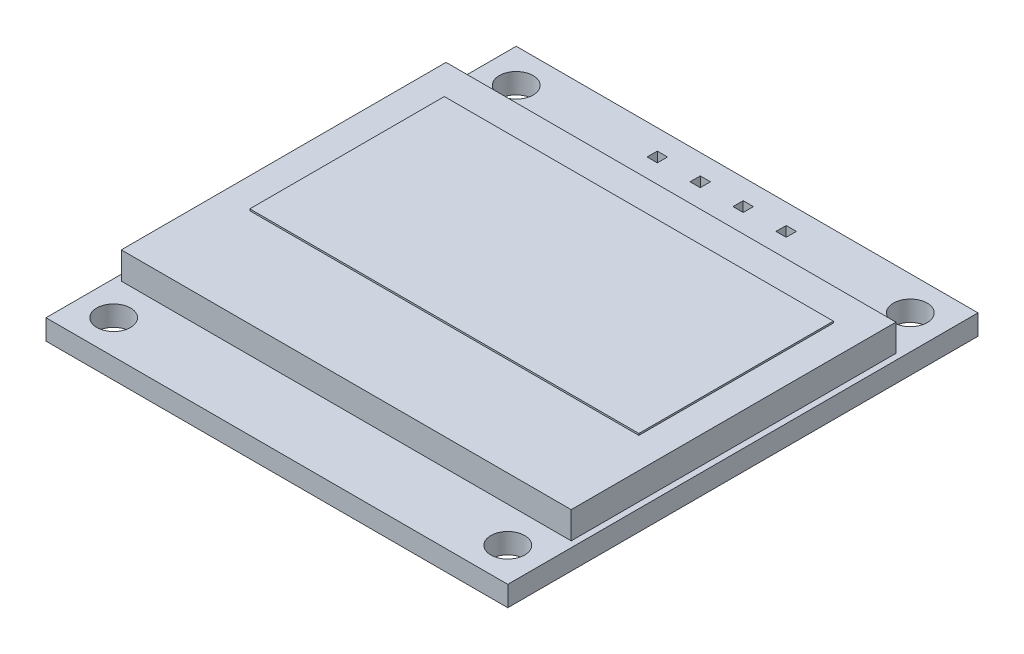
ISO-10303-21;
HEADER;
FILE_DESCRIPTION(('STEP AP214'),'2;1');
FILE_NAME('part.step','',(''),(''),'','','');
FILE_SCHEMA(('AUTOMOTIVE_DESIGN { 1 0 10303 214 1 1 1 1 }'));
ENDSEC;
DATA;
#1=APPLICATION_CONTEXT('core data for automotive mechanical design processes');
#2=APPLICATION_PROTOCOL_DEFINITION('international standard','automotive_design',2000,#1);
#3=PRODUCT_CONTEXT('',#1,'mechanical');
#4=PRODUCT('Part','Part','',(#3));
#5=PRODUCT_RELATED_PRODUCT_CATEGORY('part','',(#4));
#6=PRODUCT_DEFINITION_FORMATION('','',#4);
#7=PRODUCT_DEFINITION_CONTEXT('part definition',#1,'design');
#8=PRODUCT_DEFINITION('design','',#6,#7);
#9=PRODUCT_DEFINITION_SHAPE('','',#8);
#10=(LENGTH_UNIT() NAMED_UNIT(*) SI_UNIT(.MILLI.,.METRE.));
#11=(NAMED_UNIT(*) PLANE_ANGLE_UNIT() SI_UNIT($,.RADIAN.));
#12=(NAMED_UNIT(*) SI_UNIT($,.STERADIAN.) SOLID_ANGLE_UNIT());
#13=UNCERTAINTY_MEASURE_WITH_UNIT(LENGTH_MEASURE(1.E-05),#10,'distance_accuracy_value','');
#14=(GEOMETRIC_REPRESENTATION_CONTEXT(3) GLOBAL_UNCERTAINTY_ASSIGNED_CONTEXT((#13)) GLOBAL_UNIT_ASSIGNED_CONTEXT((#10,
#11,#12)) REPRESENTATION_CONTEXT('',''));
#15=CARTESIAN_POINT('',(0.,0.,0.));
#16=DIRECTION('',(0.,0.,1.));
#17=DIRECTION('',(1.,0.,0.));
#18=AXIS2_PLACEMENT_3D('',#15,#16,#17);
#19=CARTESIAN_POINT('',(0.,2.9,0.));
#20=DIRECTION('',(0.,-1.,0.));
#21=DIRECTION('',(0.,0.,-1.));
#22=AXIS2_PLACEMENT_3D('',#19,#20,#21);
#23=PLANE('',#22);
#24=DIRECTION('',(1.,0.,0.));
#25=VECTOR('',#24,1.);
#26=CARTESIAN_POINT('',(-11.5,2.9,-7.5));
#27=LINE('',#26,#25);
#28=CARTESIAN_POINT('',(11.5,2.9,-7.5));
#29=VERTEX_POINT('',#28);
#30=CARTESIAN_POINT('',(-11.5,2.9,-7.5));
#31=VERTEX_POINT('',#30);
#32=EDGE_CURVE('E207',#29,#31,#27,.F.);
#33=ORIENTED_EDGE('',*,*,#32,.T.);
#34=DIRECTION('',(0.,0.,-1.));
#35=VECTOR('',#34,1.);
#36=CARTESIAN_POINT('',(-11.5,2.9,4.));
#37=LINE('',#36,#35);
#38=CARTESIAN_POINT('',(-11.5,2.9,4.));
#39=VERTEX_POINT('',#38);
#40=EDGE_CURVE('E386',#31,#39,#37,.F.);
#41=ORIENTED_EDGE('',*,*,#40,.T.);
#42=DIRECTION('',(-1.,0.,0.));
#43=VECTOR('',#42,1.);
#44=CARTESIAN_POINT('',(-11.5,2.9,4.));
#45=LINE('',#44,#43);
#46=CARTESIAN_POINT('',(11.5,2.9,4.));
#47=VERTEX_POINT('',#46);
#48=EDGE_CURVE('E219',#39,#47,#45,.F.);
#49=ORIENTED_EDGE('',*,*,#48,.T.);
#50=DIRECTION('',(0.,0.,1.));
#51=VECTOR('',#50,1.);
#52=CARTESIAN_POINT('',(11.5,2.9,4.));
#53=LINE('',#52,#51);
#54=EDGE_CURVE('E201',#47,#29,#53,.F.);
#55=ORIENTED_EDGE('',*,*,#54,.T.);
#56=EDGE_LOOP('',(#33,#41,#49,#55));
#57=FACE_BOUND('',#56,.T.);
#58=ADVANCED_FACE('F17',(#57),#23,.F.);
#59=CARTESIAN_POINT('',(-11.5,2.9,-7.5));
#60=DIRECTION('',(0.,0.,1.));
#61=DIRECTION('',(1.,0.,0.));
#62=AXIS2_PLACEMENT_3D('',#59,#60,#61);
#63=PLANE('',#62);
#64=DIRECTION('',(0.,1.,0.));
#65=VECTOR('',#64,1.);
#66=CARTESIAN_POINT('',(-11.5,2.9,-7.5));
#67=LINE('',#66,#65);
#68=CARTESIAN_POINT('',(-11.5,2.8,-7.5));
#69=VERTEX_POINT('',#68);
#70=EDGE_CURVE('E212',#69,#31,#67,.T.);
#71=ORIENTED_EDGE('',*,*,#70,.T.);
#72=ORIENTED_EDGE('',*,*,#32,.F.);
#73=DIRECTION('',(0.,1.,0.));
#74=VECTOR('',#73,1.);
#75=CARTESIAN_POINT('',(11.5,2.9,-7.5));
#76=LINE('',#75,#74);
#77=CARTESIAN_POINT('',(11.5,2.8,-7.5));
#78=VERTEX_POINT('',#77);
#79=EDGE_CURVE('E210',#29,#78,#76,.F.);
#80=ORIENTED_EDGE('',*,*,#79,.T.);
#81=DIRECTION('',(1.,0.,0.));
#82=VECTOR('',#81,1.);
#83=CARTESIAN_POINT('',(0.,2.8,-7.5));
#84=LINE('',#83,#82);
#85=EDGE_CURVE('E381',#69,#78,#84,.T.);
#86=ORIENTED_EDGE('',*,*,#85,.F.);
#87=EDGE_LOOP('',(#71,#72,#80,#86));
#88=FACE_BOUND('',#87,.T.);
#89=ADVANCED_FACE('F208',(#88),#63,.F.);
#90=CARTESIAN_POINT('',(11.5,2.9,4.));
#91=DIRECTION('',(-1.,0.,0.));
#92=DIRECTION('',(0.,0.,1.));
#93=AXIS2_PLACEMENT_3D('',#90,#91,#92);
#94=PLANE('',#93);
#95=ORIENTED_EDGE('',*,*,#79,.F.);
#96=ORIENTED_EDGE('',*,*,#54,.F.);
#97=DIRECTION('',(0.,1.,0.));
#98=VECTOR('',#97,1.);
#99=CARTESIAN_POINT('',(11.5,2.9,4.));
#100=LINE('',#99,#98);
#101=CARTESIAN_POINT('',(11.5,2.8,4.));
#102=VERTEX_POINT('',#101);
#103=EDGE_CURVE('E389',#47,#102,#100,.F.);
#104=ORIENTED_EDGE('',*,*,#103,.T.);
#105=DIRECTION('',(0.,0.,1.));
#106=VECTOR('',#105,1.);
#107=CARTESIAN_POINT('',(11.5,2.8,0.));
#108=LINE('',#107,#106);
#109=EDGE_CURVE('E218',#78,#102,#108,.T.);
#110=ORIENTED_EDGE('',*,*,#109,.F.);
#111=EDGE_LOOP('',(#95,#96,#104,#110));
#112=FACE_BOUND('',#111,.T.);
#113=ADVANCED_FACE('F217',(#112),#94,.F.);
#114=CARTESIAN_POINT('',(-11.5,2.9,4.));
#115=DIRECTION('',(0.,0.,-1.));
#116=DIRECTION('',(-1.,0.,0.));
#117=AXIS2_PLACEMENT_3D('',#114,#115,#116);
#118=PLANE('',#117);
#119=ORIENTED_EDGE('',*,*,#103,.F.);
#120=ORIENTED_EDGE('',*,*,#48,.F.);
#121=DIRECTION('',(0.,1.,0.));
#122=VECTOR('',#121,1.);
#123=CARTESIAN_POINT('',(-11.5,2.9,4.));
#124=LINE('',#123,#122);
#125=CARTESIAN_POINT('',(-11.5,2.8,4.));
#126=VERTEX_POINT('',#125);
#127=EDGE_CURVE('E383',#39,#126,#124,.F.);
#128=ORIENTED_EDGE('',*,*,#127,.T.);
#129=DIRECTION('',(1.,0.,0.));
#130=VECTOR('',#129,1.);
#131=CARTESIAN_POINT('',(0.,2.8,4.));
#132=LINE('',#131,#130);
#133=EDGE_CURVE('E378',#102,#126,#132,.F.);
#134=ORIENTED_EDGE('',*,*,#133,.F.);
#135=EDGE_LOOP('',(#119,#120,#128,#134));
#136=FACE_BOUND('',#135,.T.);
#137=ADVANCED_FACE('F392',(#136),#118,.F.);
#138=CARTESIAN_POINT('',(-11.5,2.9,4.));
#139=DIRECTION('',(1.,0.,0.));
#140=DIRECTION('',(0.,0.,-1.));
#141=AXIS2_PLACEMENT_3D('',#138,#139,#140);
#142=PLANE('',#141);
#143=ORIENTED_EDGE('',*,*,#127,.F.);
#144=ORIENTED_EDGE('',*,*,#40,.F.);
#145=ORIENTED_EDGE('',*,*,#70,.F.);
#146=DIRECTION('',(0.,0.,1.));
#147=VECTOR('',#146,1.);
#148=CARTESIAN_POINT('',(-11.5,2.8,0.));
#149=LINE('',#148,#147);
#150=EDGE_CURVE('E375',#126,#69,#149,.F.);
#151=ORIENTED_EDGE('',*,*,#150,.F.);
#152=EDGE_LOOP('',(#143,#144,#145,#151));
#153=FACE_BOUND('',#152,.T.);
#154=ADVANCED_FACE('F399',(#153),#142,.F.);
#155=CARTESIAN_POINT('',(0.,2.8,0.));
#156=DIRECTION('',(0.,1.,0.));
#157=DIRECTION('',(0.,0.,1.));
#158=AXIS2_PLACEMENT_3D('',#155,#156,#157);
#159=PLANE('',#158);
#160=ORIENTED_EDGE('',*,*,#133,.T.);
#161=ORIENTED_EDGE('',*,*,#150,.T.);
#162=ORIENTED_EDGE('',*,*,#85,.T.);
#163=ORIENTED_EDGE('',*,*,#109,.T.);
#164=EDGE_LOOP('',(#160,#161,#162,#163));
#165=FACE_BOUND('',#164,.T.);
#166=DIRECTION('',(0.,0.,-1.));
#167=VECTOR('',#166,1.);
#168=CARTESIAN_POINT('',(-13.3,2.8,-9.4));
#169=LINE('',#168,#167);
#170=CARTESIAN_POINT('',(-13.3,2.8,-9.4));
#171=VERTEX_POINT('',#170);
#172=CARTESIAN_POINT('',(-13.3,2.8,9.8));
#173=VERTEX_POINT('',#172);
#174=EDGE_CURVE('E355',#171,#173,#169,.F.);
#175=ORIENTED_EDGE('',*,*,#174,.T.);
#176=DIRECTION('',(-1.,0.,0.));
#177=VECTOR('',#176,1.);
#178=CARTESIAN_POINT('',(-13.3,2.8,9.8));
#179=LINE('',#178,#177);
#180=CARTESIAN_POINT('',(13.3,2.8,9.8));
#181=VERTEX_POINT('',#180);
#182=EDGE_CURVE('E364',#173,#181,#179,.F.);
#183=ORIENTED_EDGE('',*,*,#182,.T.);
#184=DIRECTION('',(0.,0.,1.));
#185=VECTOR('',#184,1.);
#186=CARTESIAN_POINT('',(13.3,2.8,-9.4));
#187=LINE('',#186,#185);
#188=CARTESIAN_POINT('',(13.3,2.8,-9.4));
#189=VERTEX_POINT('',#188);
#190=EDGE_CURVE('E370',#181,#189,#187,.F.);
#191=ORIENTED_EDGE('',*,*,#190,.T.);
#192=DIRECTION('',(1.,0.,0.));
#193=VECTOR('',#192,1.);
#194=CARTESIAN_POINT('',(-13.3,2.8,-9.4));
#195=LINE('',#194,#193);
#196=EDGE_CURVE('E373',#189,#171,#195,.F.);
#197=ORIENTED_EDGE('',*,*,#196,.T.);
#198=EDGE_LOOP('',(#175,#183,#191,#197));
#199=FACE_BOUND('',#198,.T.);
#200=ADVANCED_FACE('F396',(#165,#199),#159,.T.);
#201=CARTESIAN_POINT('',(-13.3,2.8,-9.4));
#202=DIRECTION('',(0.,0.,1.));
#203=DIRECTION('',(1.,0.,0.));
#204=AXIS2_PLACEMENT_3D('',#201,#202,#203);
#205=PLANE('',#204);
#206=DIRECTION('',(0.,1.,0.));
#207=VECTOR('',#206,1.);
#208=CARTESIAN_POINT('',(-13.3,2.8,-9.4));
#209=LINE('',#208,#207);
#210=CARTESIAN_POINT('',(-13.3,1.2,-9.4));
#211=VERTEX_POINT('',#210);
#212=EDGE_CURVE('E358',#211,#171,#209,.T.);
#213=ORIENTED_EDGE('',*,*,#212,.T.);
#214=ORIENTED_EDGE('',*,*,#196,.F.);
#215=DIRECTION('',(0.,1.,0.));
#216=VECTOR('',#215,1.);
#217=CARTESIAN_POINT('',(13.3,2.8,-9.4));
#218=LINE('',#217,#216);
#219=CARTESIAN_POINT('',(13.3,1.2,-9.4));
#220=VERTEX_POINT('',#219);
#221=EDGE_CURVE('E367',#189,#220,#218,.F.);
#222=ORIENTED_EDGE('',*,*,#221,.T.);
#223=DIRECTION('',(1.,0.,0.));
#224=VECTOR('',#223,1.);
#225=CARTESIAN_POINT('',(0.,1.2,-9.4));
#226=LINE('',#225,#224);
#227=EDGE_CURVE('E350',#211,#220,#226,.T.);
#228=ORIENTED_EDGE('',*,*,#227,.F.);
#229=EDGE_LOOP('',(#213,#214,#222,#228));
#230=FACE_BOUND('',#229,.T.);
#231=ADVANCED_FACE('F407',(#230),#205,.F.);
#232=CARTESIAN_POINT('',(13.3,2.8,-9.4));
#233=DIRECTION('',(-1.,0.,0.));
#234=DIRECTION('',(0.,0.,1.));
#235=AXIS2_PLACEMENT_3D('',#232,#233,#234);
#236=PLANE('',#235);
#237=ORIENTED_EDGE('',*,*,#221,.F.);
#238=ORIENTED_EDGE('',*,*,#190,.F.);
#239=DIRECTION('',(0.,1.,0.));
#240=VECTOR('',#239,1.);
#241=CARTESIAN_POINT('',(13.3,2.8,9.8));
#242=LINE('',#241,#240);
#243=CARTESIAN_POINT('',(13.3,1.2,9.8));
#244=VERTEX_POINT('',#243);
#245=EDGE_CURVE('E361',#181,#244,#242,.F.);
#246=ORIENTED_EDGE('',*,*,#245,.T.);
#247=DIRECTION('',(0.,0.,1.));
#248=VECTOR('',#247,1.);
#249=CARTESIAN_POINT('',(13.3,1.2,0.));
#250=LINE('',#249,#248);
#251=EDGE_CURVE('E348',#220,#244,#250,.T.);
#252=ORIENTED_EDGE('',*,*,#251,.F.);
#253=EDGE_LOOP('',(#237,#238,#246,#252));
#254=FACE_BOUND('',#253,.T.);
#255=ADVANCED_FACE('F524',(#254),#236,.F.);
#256=CARTESIAN_POINT('',(-13.3,2.8,9.8));
#257=DIRECTION('',(0.,0.,-1.));
#258=DIRECTION('',(-1.,0.,0.));
#259=AXIS2_PLACEMENT_3D('',#256,#257,#258);
#260=PLANE('',#259);
#261=ORIENTED_EDGE('',*,*,#245,.F.);
#262=ORIENTED_EDGE('',*,*,#182,.F.);
#263=DIRECTION('',(0.,1.,0.));
#264=VECTOR('',#263,1.);
#265=CARTESIAN_POINT('',(-13.3,2.8,9.8));
#266=LINE('',#265,#264);
#267=CARTESIAN_POINT('',(-13.3,1.2,9.8));
#268=VERTEX_POINT('',#267);
#269=EDGE_CURVE('E352',#173,#268,#266,.F.);
#270=ORIENTED_EDGE('',*,*,#269,.T.);
#271=DIRECTION('',(1.,0.,0.));
#272=VECTOR('',#271,1.);
#273=CARTESIAN_POINT('',(0.,1.2,9.8));
#274=LINE('',#273,#272);
#275=EDGE_CURVE('E346',#244,#268,#274,.F.);
#276=ORIENTED_EDGE('',*,*,#275,.F.);
#277=EDGE_LOOP('',(#261,#262,#270,#276));
#278=FACE_BOUND('',#277,.T.);
#279=ADVANCED_FACE('F520',(#278),#260,.F.);
#280=CARTESIAN_POINT('',(-13.3,2.8,-9.4));
#281=DIRECTION('',(1.,0.,0.));
#282=DIRECTION('',(0.,0.,-1.));
#283=AXIS2_PLACEMENT_3D('',#280,#281,#282);
#284=PLANE('',#283);
#285=ORIENTED_EDGE('',*,*,#269,.F.);
#286=ORIENTED_EDGE('',*,*,#174,.F.);
#287=ORIENTED_EDGE('',*,*,#212,.F.);
#288=DIRECTION('',(0.,0.,1.));
#289=VECTOR('',#288,1.);
#290=CARTESIAN_POINT('',(-13.3,1.2,0.));
#291=LINE('',#290,#289);
#292=EDGE_CURVE('E343',#268,#211,#291,.F.);
#293=ORIENTED_EDGE('',*,*,#292,.F.);
#294=EDGE_LOOP('',(#285,#286,#287,#293));
#295=FACE_BOUND('',#294,.T.);
#296=ADVANCED_FACE('F516',(#295),#284,.F.);
#297=CARTESIAN_POINT('',(0.,1.2,0.));
#298=DIRECTION('',(0.,1.,0.));
#299=DIRECTION('',(0.,0.,1.));
#300=AXIS2_PLACEMENT_3D('',#297,#298,#299);
#301=PLANE('',#300);
#302=ORIENTED_EDGE('',*,*,#275,.T.);
#303=ORIENTED_EDGE('',*,*,#292,.T.);
#304=ORIENTED_EDGE('',*,*,#227,.T.);
#305=ORIENTED_EDGE('',*,*,#251,.T.);
#306=EDGE_LOOP('',(#302,#303,#304,#305));
#307=FACE_BOUND('',#306,.T.);
#308=CARTESIAN_POINT('',(11.65,1.2,11.9));
#309=DIRECTION('',(0.,-1.,0.));
#310=DIRECTION('',(0.,0.,-1.));
#311=AXIS2_PLACEMENT_3D('',#308,#309,#310);
#312=CIRCLE('',#311,1.);
#313=CARTESIAN_POINT('',(11.65,1.2,10.9));
#314=VERTEX_POINT('',#313);
#315=EDGE_CURVE('E20',#314,#314,#312,.T.);
#316=ORIENTED_EDGE('',*,*,#315,.T.);
#317=EDGE_LOOP('',(#316));
#318=FACE_BOUND('',#317,.T.);
#319=CARTESIAN_POINT('',(-11.65,1.2,-11.9));
#320=DIRECTION('',(0.,-1.,0.));
#321=DIRECTION('',(0.,0.,-1.));
#322=AXIS2_PLACEMENT_3D('',#319,#320,#321);
#323=CIRCLE('',#322,1.);
#324=CARTESIAN_POINT('',(-11.65,1.2,-12.9));
#325=VERTEX_POINT('',#324);
#326=EDGE_CURVE('E243',#325,#325,#323,.T.);
#327=ORIENTED_EDGE('',*,*,#326,.T.);
#328=EDGE_LOOP('',(#327));
#329=FACE_BOUND('',#328,.T.);
#330=DIRECTION('',(0.,0.,-1.));
#331=VECTOR('',#330,1.);
#332=CARTESIAN_POINT('',(-13.65,1.2,-13.9));
#333=LINE('',#332,#331);
#334=CARTESIAN_POINT('',(-13.65,1.2,-13.9));
#335=VERTEX_POINT('',#334);
#336=CARTESIAN_POINT('',(-13.65,1.2,13.9));
#337=VERTEX_POINT('',#336);
#338=EDGE_CURVE('E544',#335,#337,#333,.F.);
#339=ORIENTED_EDGE('',*,*,#338,.T.);
#340=DIRECTION('',(-1.,0.,0.));
#341=VECTOR('',#340,1.);
#342=CARTESIAN_POINT('',(-13.65,1.2,13.9));
#343=LINE('',#342,#341);
#344=CARTESIAN_POINT('',(13.65,1.2,13.9));
#345=VERTEX_POINT('',#344);
#346=EDGE_CURVE('E578',#337,#345,#343,.F.);
#347=ORIENTED_EDGE('',*,*,#346,.T.);
#348=DIRECTION('',(0.,0.,1.));
#349=VECTOR('',#348,1.);
#350=CARTESIAN_POINT('',(13.65,1.2,-13.9));
#351=LINE('',#350,#349);
#352=CARTESIAN_POINT('',(13.65,1.2,-13.9));
#353=VERTEX_POINT('',#352);
#354=EDGE_CURVE('E574',#345,#353,#351,.F.);
#355=ORIENTED_EDGE('',*,*,#354,.T.);
#356=DIRECTION('',(1.,0.,0.));
#357=VECTOR('',#356,1.);
#358=CARTESIAN_POINT('',(-13.65,1.2,-13.9));
#359=LINE('',#358,#357);
#360=EDGE_CURVE('E245',#353,#335,#359,.F.);
#361=ORIENTED_EDGE('',*,*,#360,.T.);
#362=EDGE_LOOP('',(#339,#347,#355,#361));
#363=FACE_BOUND('',#362,.T.);
#364=CARTESIAN_POINT('',(11.65,1.2,-11.9));
#365=DIRECTION('',(0.,-1.,0.));
#366=DIRECTION('',(0.,0.,-1.));
#367=AXIS2_PLACEMENT_3D('',#364,#365,#366);
#368=CIRCLE('',#367,1.);
#369=CARTESIAN_POINT('',(11.65,1.2,-12.9));
#370=VERTEX_POINT('',#369);
#371=EDGE_CURVE('E240',#370,#370,#368,.T.);
#372=ORIENTED_EDGE('',*,*,#371,.T.);
#373=EDGE_LOOP('',(#372));
#374=FACE_BOUND('',#373,.T.);
#375=CARTESIAN_POINT('',(-11.65,1.2,11.9));
#376=DIRECTION('',(0.,-1.,0.));
#377=DIRECTION('',(0.,0.,-1.));
#378=AXIS2_PLACEMENT_3D('',#375,#376,#377);
#379=CIRCLE('',#378,1.);
#380=CARTESIAN_POINT('',(-11.65,1.2,10.9));
#381=VERTEX_POINT('',#380);
#382=EDGE_CURVE('E236',#381,#381,#379,.T.);
#383=ORIENTED_EDGE('',*,*,#382,.T.);
#384=EDGE_LOOP('',(#383));
#385=FACE_BOUND('',#384,.T.);
#386=DIRECTION('',(0.,0.,1.));
#387=VECTOR('',#386,1.);
#388=CARTESIAN_POINT('',(-4.111420977446,1.2,-12.70142097744));
#389=LINE('',#388,#387);
#390=CARTESIAN_POINT('',(-4.111420977446,1.2,-12.09857902255));
#391=VERTEX_POINT('',#390);
#392=CARTESIAN_POINT('',(-4.111420977446,1.2,-12.70142097744));
#393=VERTEX_POINT('',#392);
#394=EDGE_CURVE('E278',#391,#393,#389,.F.);
#395=ORIENTED_EDGE('',*,*,#394,.T.);
#396=DIRECTION('',(-1.,0.,0.));
#397=VECTOR('',#396,1.);
#398=CARTESIAN_POINT('',(-4.111420977446,1.2,-12.70142097744));
#399=LINE('',#398,#397);
#400=CARTESIAN_POINT('',(-3.508579022554,1.2,-12.70142097744));
#401=VERTEX_POINT('',#400);
#402=EDGE_CURVE('E273',#393,#401,#399,.F.);
#403=ORIENTED_EDGE('',*,*,#402,.T.);
#404=DIRECTION('',(0.,0.,-1.));
#405=VECTOR('',#404,1.);
#406=CARTESIAN_POINT('',(-3.508579022554,1.2,-12.70142097744));
#407=LINE('',#406,#405);
#408=CARTESIAN_POINT('',(-3.508579022554,1.2,-12.09857902255));
#409=VERTEX_POINT('',#408);
#410=EDGE_CURVE('E268',#401,#409,#407,.F.);
#411=ORIENTED_EDGE('',*,*,#410,.T.);
#412=DIRECTION('',(1.,0.,0.));
#413=VECTOR('',#412,1.);
#414=CARTESIAN_POINT('',(-4.111420977446,1.2,-12.09857902255));
#415=LINE('',#414,#413);
#416=EDGE_CURVE('E255',#409,#391,#415,.F.);
#417=ORIENTED_EDGE('',*,*,#416,.T.);
#418=EDGE_LOOP('',(#395,#403,#411,#417));
#419=FACE_BOUND('',#418,.T.);
#420=DIRECTION('',(-1.,0.,0.));
#421=VECTOR('',#420,1.);
#422=CARTESIAN_POINT('',(-1.571420977446,1.2,-12.70142097744));
#423=LINE('',#422,#421);
#424=CARTESIAN_POINT('',(-1.571420977446,1.2,-12.70142097744));
#425=VERTEX_POINT('',#424);
#426=CARTESIAN_POINT('',(-0.968579022554,1.2,-12.70142097744));
#427=VERTEX_POINT('',#426);
#428=EDGE_CURVE('E299',#425,#427,#423,.F.);
#429=ORIENTED_EDGE('',*,*,#428,.T.);
#430=DIRECTION('',(0.,0.,-1.));
#431=VECTOR('',#430,1.);
#432=CARTESIAN_POINT('',(-0.968579022554,1.2,-12.70142097744));
#433=LINE('',#432,#431);
#434=CARTESIAN_POINT('',(-0.968579022554,1.2,-12.09857902255));
#435=VERTEX_POINT('',#434);
#436=EDGE_CURVE('E294',#427,#435,#433,.F.);
#437=ORIENTED_EDGE('',*,*,#436,.T.);
#438=DIRECTION('',(1.,0.,0.));
#439=VECTOR('',#438,1.);
#440=CARTESIAN_POINT('',(-1.571420977446,1.2,-12.09857902255));
#441=LINE('',#440,#439);
#442=CARTESIAN_POINT('',(-1.571420977446,1.2,-12.09857902255));
#443=VERTEX_POINT('',#442);
#444=EDGE_CURVE('E289',#435,#443,#441,.F.);
#445=ORIENTED_EDGE('',*,*,#444,.T.);
#446=DIRECTION('',(0.,0.,1.));
#447=VECTOR('',#446,1.);
#448=CARTESIAN_POINT('',(-1.571420977446,1.2,-12.70142097744));
#449=LINE('',#448,#447);
#450=EDGE_CURVE('E283',#443,#425,#449,.F.);
#451=ORIENTED_EDGE('',*,*,#450,.T.);
#452=EDGE_LOOP('',(#429,#437,#445,#451));
#453=FACE_BOUND('',#452,.T.);
#454=DIRECTION('',(-1.,0.,0.));
#455=VECTOR('',#454,1.);
#456=CARTESIAN_POINT('',(0.968579022554,1.2,-12.70142097744));
#457=LINE('',#456,#455);
#458=CARTESIAN_POINT('',(0.968579022554,1.2,-12.70142097744));
#459=VERTEX_POINT('',#458);
#460=CARTESIAN_POINT('',(1.571420977446,1.2,-12.70142097744));
#461=VERTEX_POINT('',#460);
#462=EDGE_CURVE('E320',#459,#461,#457,.F.);
#463=ORIENTED_EDGE('',*,*,#462,.T.);
#464=DIRECTION('',(0.,0.,-1.));
#465=VECTOR('',#464,1.);
#466=CARTESIAN_POINT('',(1.571420977446,1.2,-12.70142097744));
#467=LINE('',#466,#465);
#468=CARTESIAN_POINT('',(1.571420977446,1.2,-12.09857902255));
#469=VERTEX_POINT('',#468);
#470=EDGE_CURVE('E315',#461,#469,#467,.F.);
#471=ORIENTED_EDGE('',*,*,#470,.T.);
#472=DIRECTION('',(1.,0.,0.));
#473=VECTOR('',#472,1.);
#474=CARTESIAN_POINT('',(0.968579022554,1.2,-12.09857902255));
#475=LINE('',#474,#473);
#476=CARTESIAN_POINT('',(0.968579022554,1.2,-12.09857902255));
#477=VERTEX_POINT('',#476);
#478=EDGE_CURVE('E310',#469,#477,#475,.F.);
#479=ORIENTED_EDGE('',*,*,#478,.T.);
#480=DIRECTION('',(0.,0.,1.));
#481=VECTOR('',#480,1.);
#482=CARTESIAN_POINT('',(0.968579022554,1.2,-12.70142097744));
#483=LINE('',#482,#481);
#484=EDGE_CURVE('E304',#477,#459,#483,.F.);
#485=ORIENTED_EDGE('',*,*,#484,.T.);
#486=EDGE_LOOP('',(#463,#471,#479,#485));
#487=FACE_BOUND('',#486,.T.);
#488=DIRECTION('',(-1.,0.,0.));
#489=VECTOR('',#488,1.);
#490=CARTESIAN_POINT('',(3.508579022554,1.2,-12.70142097744));
#491=LINE('',#490,#489);
#492=CARTESIAN_POINT('',(3.508579022554,1.2,-12.70142097744));
#493=VERTEX_POINT('',#492);
#494=CARTESIAN_POINT('',(4.111420977446,1.2,-12.70142097744));
#495=VERTEX_POINT('',#494);
#496=EDGE_CURVE('E341',#493,#495,#491,.F.);
#497=ORIENTED_EDGE('',*,*,#496,.T.);
#498=DIRECTION('',(0.,0.,-1.));
#499=VECTOR('',#498,1.);
#500=CARTESIAN_POINT('',(4.111420977446,1.2,-12.70142097744));
#501=LINE('',#500,#499);
#502=CARTESIAN_POINT('',(4.111420977446,1.2,-12.09857902255));
#503=VERTEX_POINT('',#502);
#504=EDGE_CURVE('E336',#495,#503,#501,.F.);
#505=ORIENTED_EDGE('',*,*,#504,.T.);
#506=DIRECTION('',(1.,0.,0.));
#507=VECTOR('',#506,1.);
#508=CARTESIAN_POINT('',(3.508579022554,1.2,-12.09857902255));
#509=LINE('',#508,#507);
#510=CARTESIAN_POINT('',(3.508579022554,1.2,-12.09857902255));
#511=VERTEX_POINT('',#510);
#512=EDGE_CURVE('E331',#503,#511,#509,.F.);
#513=ORIENTED_EDGE('',*,*,#512,.T.);
#514=DIRECTION('',(0.,0.,1.));
#515=VECTOR('',#514,1.);
#516=CARTESIAN_POINT('',(3.508579022554,1.2,-12.70142097744));
#517=LINE('',#516,#515);
#518=EDGE_CURVE('E325',#511,#493,#517,.F.);
#519=ORIENTED_EDGE('',*,*,#518,.T.);
#520=EDGE_LOOP('',(#497,#505,#513,#519));
#521=FACE_BOUND('',#520,.T.);
#522=ADVANCED_FACE('F512',(#307,#318,#329,#363,#374,#385,#419,#453,#487,#521),#301,.T.);
#523=CARTESIAN_POINT('',(3.508579022554,-0.8,-12.70142097744));
#524=DIRECTION('',(0.,0.,-1.));
#525=DIRECTION('',(-1.,0.,0.));
#526=AXIS2_PLACEMENT_3D('',#523,#524,#525);
#527=PLANE('',#526);
#528=ORIENTED_EDGE('',*,*,#496,.F.);
#529=DIRECTION('',(0.,1.,0.));
#530=VECTOR('',#529,1.);
#531=CARTESIAN_POINT('',(3.508579022554,-0.8,-12.70142097744));
#532=LINE('',#531,#530);
#533=CARTESIAN_POINT('',(3.508579022554,0.,-12.70142097744));
#534=VERTEX_POINT('',#533);
#535=EDGE_CURVE('E322',#493,#534,#532,.F.);
#536=ORIENTED_EDGE('',*,*,#535,.T.);
#537=DIRECTION('',(1.,0.,0.));
#538=VECTOR('',#537,1.);
#539=CARTESIAN_POINT('',(0.,0.,-12.70142097744));
#540=LINE('',#539,#538);
#541=CARTESIAN_POINT('',(4.111420977446,0.,-12.70142097744));
#542=VERTEX_POINT('',#541);
#543=EDGE_CURVE('E239',#534,#542,#540,.T.);
#544=ORIENTED_EDGE('',*,*,#543,.T.);
#545=DIRECTION('',(0.,1.,0.));
#546=VECTOR('',#545,1.);
#547=CARTESIAN_POINT('',(4.111420977446,-0.8,-12.70142097744));
#548=LINE('',#547,#546);
#549=EDGE_CURVE('E338',#542,#495,#548,.T.);
#550=ORIENTED_EDGE('',*,*,#549,.T.);
#551=EDGE_LOOP('',(#528,#536,#544,#550));
#552=FACE_BOUND('',#551,.T.);
#553=ADVANCED_FACE('F508',(#552),#527,.F.);
#554=CARTESIAN_POINT('',(4.111420977446,-0.8,-12.70142097744));
#555=DIRECTION('',(1.,0.,0.));
#556=DIRECTION('',(0.,0.,-1.));
#557=AXIS2_PLACEMENT_3D('',#554,#555,#556);
#558=PLANE('',#557);
#559=ORIENTED_EDGE('',*,*,#504,.F.);
#560=ORIENTED_EDGE('',*,*,#549,.F.);
#561=DIRECTION('',(0.,0.,1.));
#562=VECTOR('',#561,1.);
#563=CARTESIAN_POINT('',(4.111420977446,0.,0.));
#564=LINE('',#563,#562);
#565=CARTESIAN_POINT('',(4.111420977446,0.,-12.09857902255));
#566=VERTEX_POINT('',#565);
#567=EDGE_CURVE('E566',#542,#566,#564,.T.);
#568=ORIENTED_EDGE('',*,*,#567,.T.);
#569=DIRECTION('',(0.,1.,0.));
#570=VECTOR('',#569,1.);
#571=CARTESIAN_POINT('',(4.111420977446,-0.8,-12.09857902255));
#572=LINE('',#571,#570);
#573=EDGE_CURVE('E333',#566,#503,#572,.T.);
#574=ORIENTED_EDGE('',*,*,#573,.T.);
#575=EDGE_LOOP('',(#559,#560,#568,#574));
#576=FACE_BOUND('',#575,.T.);
#577=ADVANCED_FACE('F504',(#576),#558,.F.);
#578=CARTESIAN_POINT('',(3.508579022554,-0.8,-12.09857902255));
#579=DIRECTION('',(0.,0.,1.));
#580=DIRECTION('',(1.,0.,0.));
#581=AXIS2_PLACEMENT_3D('',#578,#579,#580);
#582=PLANE('',#581);
#583=ORIENTED_EDGE('',*,*,#512,.F.);
#584=ORIENTED_EDGE('',*,*,#573,.F.);
#585=DIRECTION('',(1.,0.,0.));
#586=VECTOR('',#585,1.);
#587=CARTESIAN_POINT('',(0.,0.,-12.09857902255));
#588=LINE('',#587,#586);
#589=CARTESIAN_POINT('',(3.508579022554,0.,-12.09857902255));
#590=VERTEX_POINT('',#589);
#591=EDGE_CURVE('E568',#566,#590,#588,.F.);
#592=ORIENTED_EDGE('',*,*,#591,.T.);
#593=DIRECTION('',(0.,1.,0.));
#594=VECTOR('',#593,1.);
#595=CARTESIAN_POINT('',(3.508579022554,-0.8,-12.09857902255));
#596=LINE('',#595,#594);
#597=EDGE_CURVE('E328',#590,#511,#596,.T.);
#598=ORIENTED_EDGE('',*,*,#597,.T.);
#599=EDGE_LOOP('',(#583,#584,#592,#598));
#600=FACE_BOUND('',#599,.T.);
#601=ADVANCED_FACE('F500',(#600),#582,.F.);
#602=CARTESIAN_POINT('',(3.508579022554,-0.8,-12.70142097744));
#603=DIRECTION('',(-1.,0.,0.));
#604=DIRECTION('',(0.,0.,1.));
#605=AXIS2_PLACEMENT_3D('',#602,#603,#604);
#606=PLANE('',#605);
#607=ORIENTED_EDGE('',*,*,#518,.F.);
#608=ORIENTED_EDGE('',*,*,#597,.F.);
#609=DIRECTION('',(0.,0.,1.));
#610=VECTOR('',#609,1.);
#611=CARTESIAN_POINT('',(3.508579022554,0.,0.));
#612=LINE('',#611,#610);
#613=EDGE_CURVE('E632',#590,#534,#612,.F.);
#614=ORIENTED_EDGE('',*,*,#613,.T.);
#615=ORIENTED_EDGE('',*,*,#535,.F.);
#616=EDGE_LOOP('',(#607,#608,#614,#615));
#617=FACE_BOUND('',#616,.T.);
#618=ADVANCED_FACE('F496',(#617),#606,.F.);
#619=CARTESIAN_POINT('',(0.968579022554,-0.8,-12.70142097744));
#620=DIRECTION('',(0.,0.,-1.));
#621=DIRECTION('',(-1.,0.,0.));
#622=AXIS2_PLACEMENT_3D('',#619,#620,#621);
#623=PLANE('',#622);
#624=ORIENTED_EDGE('',*,*,#462,.F.);
#625=DIRECTION('',(0.,1.,0.));
#626=VECTOR('',#625,1.);
#627=CARTESIAN_POINT('',(0.968579022554,-0.8,-12.70142097744));
#628=LINE('',#627,#626);
#629=CARTESIAN_POINT('',(0.968579022554,0.,-12.70142097744));
#630=VERTEX_POINT('',#629);
#631=EDGE_CURVE('E301',#459,#630,#628,.F.);
#632=ORIENTED_EDGE('',*,*,#631,.T.);
#633=DIRECTION('',(1.,0.,0.));
#634=VECTOR('',#633,1.);
#635=CARTESIAN_POINT('',(0.,0.,-12.70142097744));
#636=LINE('',#635,#634);
#637=CARTESIAN_POINT('',(1.571420977446,0.,-12.70142097744));
#638=VERTEX_POINT('',#637);
#639=EDGE_CURVE('E629',#630,#638,#636,.T.);
#640=ORIENTED_EDGE('',*,*,#639,.T.);
#641=DIRECTION('',(0.,1.,0.));
#642=VECTOR('',#641,1.);
#643=CARTESIAN_POINT('',(1.571420977446,-0.8,-12.70142097744));
#644=LINE('',#643,#642);
#645=EDGE_CURVE('E317',#638,#461,#644,.T.);
#646=ORIENTED_EDGE('',*,*,#645,.T.);
#647=EDGE_LOOP('',(#624,#632,#640,#646));
#648=FACE_BOUND('',#647,.T.);
#649=ADVANCED_FACE('F492',(#648),#623,.F.);
#650=CARTESIAN_POINT('',(1.571420977446,-0.8,-12.70142097744));
#651=DIRECTION('',(1.,0.,0.));
#652=DIRECTION('',(0.,0.,-1.));
#653=AXIS2_PLACEMENT_3D('',#650,#651,#652);
#654=PLANE('',#653);
#655=ORIENTED_EDGE('',*,*,#470,.F.);
#656=ORIENTED_EDGE('',*,*,#645,.F.);
#657=DIRECTION('',(0.,0.,1.));
#658=VECTOR('',#657,1.);
#659=CARTESIAN_POINT('',(1.571420977446,0.,0.));
#660=LINE('',#659,#658);
#661=CARTESIAN_POINT('',(1.571420977446,0.,-12.09857902255));
#662=VERTEX_POINT('',#661);
#663=EDGE_CURVE('E626',#638,#662,#660,.T.);
#664=ORIENTED_EDGE('',*,*,#663,.T.);
#665=DIRECTION('',(0.,1.,0.));
#666=VECTOR('',#665,1.);
#667=CARTESIAN_POINT('',(1.571420977446,-0.8,-12.09857902255));
#668=LINE('',#667,#666);
#669=EDGE_CURVE('E312',#662,#469,#668,.T.);
#670=ORIENTED_EDGE('',*,*,#669,.T.);
#671=EDGE_LOOP('',(#655,#656,#664,#670));
#672=FACE_BOUND('',#671,.T.);
#673=ADVANCED_FACE('F488',(#672),#654,.F.);
#674=CARTESIAN_POINT('',(0.968579022554,-0.8,-12.09857902255));
#675=DIRECTION('',(0.,0.,1.));
#676=DIRECTION('',(1.,0.,0.));
#677=AXIS2_PLACEMENT_3D('',#674,#675,#676);
#678=PLANE('',#677);
#679=ORIENTED_EDGE('',*,*,#478,.F.);
#680=ORIENTED_EDGE('',*,*,#669,.F.);
#681=DIRECTION('',(1.,0.,0.));
#682=VECTOR('',#681,1.);
#683=CARTESIAN_POINT('',(0.,0.,-12.09857902255));
#684=LINE('',#683,#682);
#685=CARTESIAN_POINT('',(0.968579022554,0.,-12.09857902255));
#686=VERTEX_POINT('',#685);
#687=EDGE_CURVE('E623',#662,#686,#684,.F.);
#688=ORIENTED_EDGE('',*,*,#687,.T.);
#689=DIRECTION('',(0.,1.,0.));
#690=VECTOR('',#689,1.);
#691=CARTESIAN_POINT('',(0.968579022554,-0.8,-12.09857902255));
#692=LINE('',#691,#690);
#693=EDGE_CURVE('E307',#686,#477,#692,.T.);
#694=ORIENTED_EDGE('',*,*,#693,.T.);
#695=EDGE_LOOP('',(#679,#680,#688,#694));
#696=FACE_BOUND('',#695,.T.);
#697=ADVANCED_FACE('F484',(#696),#678,.F.);
#698=CARTESIAN_POINT('',(0.968579022554,-0.8,-12.70142097744));
#699=DIRECTION('',(-1.,0.,0.));
#700=DIRECTION('',(0.,0.,1.));
#701=AXIS2_PLACEMENT_3D('',#698,#699,#700);
#702=PLANE('',#701);
#703=ORIENTED_EDGE('',*,*,#484,.F.);
#704=ORIENTED_EDGE('',*,*,#693,.F.);
#705=DIRECTION('',(0.,0.,1.));
#706=VECTOR('',#705,1.);
#707=CARTESIAN_POINT('',(0.968579022554,0.,0.));
#708=LINE('',#707,#706);
#709=EDGE_CURVE('E620',#686,#630,#708,.F.);
#710=ORIENTED_EDGE('',*,*,#709,.T.);
#711=ORIENTED_EDGE('',*,*,#631,.F.);
#712=EDGE_LOOP('',(#703,#704,#710,#711));
#713=FACE_BOUND('',#712,.T.);
#714=ADVANCED_FACE('F480',(#713),#702,.F.);
#715=CARTESIAN_POINT('',(-1.571420977446,-0.8,-12.70142097744));
#716=DIRECTION('',(0.,0.,-1.));
#717=DIRECTION('',(-1.,0.,0.));
#718=AXIS2_PLACEMENT_3D('',#715,#716,#717);
#719=PLANE('',#718);
#720=ORIENTED_EDGE('',*,*,#428,.F.);
#721=DIRECTION('',(0.,1.,0.));
#722=VECTOR('',#721,1.);
#723=CARTESIAN_POINT('',(-1.571420977446,-0.8,-12.70142097744));
#724=LINE('',#723,#722);
#725=CARTESIAN_POINT('',(-1.571420977446,0.,-12.70142097744));
#726=VERTEX_POINT('',#725);
#727=EDGE_CURVE('E280',#425,#726,#724,.F.);
#728=ORIENTED_EDGE('',*,*,#727,.T.);
#729=DIRECTION('',(1.,0.,0.));
#730=VECTOR('',#729,1.);
#731=CARTESIAN_POINT('',(0.,0.,-12.70142097744));
#732=LINE('',#731,#730);
#733=CARTESIAN_POINT('',(-0.968579022554,0.,-12.70142097744));
#734=VERTEX_POINT('',#733);
#735=EDGE_CURVE('E617',#726,#734,#732,.T.);
#736=ORIENTED_EDGE('',*,*,#735,.T.);
#737=DIRECTION('',(0.,1.,0.));
#738=VECTOR('',#737,1.);
#739=CARTESIAN_POINT('',(-0.968579022554,-0.8,-12.70142097744));
#740=LINE('',#739,#738);
#741=EDGE_CURVE('E296',#734,#427,#740,.T.);
#742=ORIENTED_EDGE('',*,*,#741,.T.);
#743=EDGE_LOOP('',(#720,#728,#736,#742));
#744=FACE_BOUND('',#743,.T.);
#745=ADVANCED_FACE('F476',(#744),#719,.F.);
#746=CARTESIAN_POINT('',(-0.968579022554,-0.8,-12.70142097744));
#747=DIRECTION('',(1.,0.,0.));
#748=DIRECTION('',(0.,0.,-1.));
#749=AXIS2_PLACEMENT_3D('',#746,#747,#748);
#750=PLANE('',#749);
#751=ORIENTED_EDGE('',*,*,#436,.F.);
#752=ORIENTED_EDGE('',*,*,#741,.F.);
#753=DIRECTION('',(0.,0.,1.));
#754=VECTOR('',#753,1.);
#755=CARTESIAN_POINT('',(-0.968579022554,0.,0.));
#756=LINE('',#755,#754);
#757=CARTESIAN_POINT('',(-0.968579022554,0.,-12.09857902255));
#758=VERTEX_POINT('',#757);
#759=EDGE_CURVE('E614',#734,#758,#756,.T.);
#760=ORIENTED_EDGE('',*,*,#759,.T.);
#761=DIRECTION('',(0.,1.,0.));
#762=VECTOR('',#761,1.);
#763=CARTESIAN_POINT('',(-0.968579022554,-0.8,-12.09857902255));
#764=LINE('',#763,#762);
#765=EDGE_CURVE('E291',#758,#435,#764,.T.);
#766=ORIENTED_EDGE('',*,*,#765,.T.);
#767=EDGE_LOOP('',(#751,#752,#760,#766));
#768=FACE_BOUND('',#767,.T.);
#769=ADVANCED_FACE('F472',(#768),#750,.F.);
#770=CARTESIAN_POINT('',(-1.571420977446,-0.8,-12.09857902255));
#771=DIRECTION('',(0.,0.,1.));
#772=DIRECTION('',(1.,0.,0.));
#773=AXIS2_PLACEMENT_3D('',#770,#771,#772);
#774=PLANE('',#773);
#775=ORIENTED_EDGE('',*,*,#444,.F.);
#776=ORIENTED_EDGE('',*,*,#765,.F.);
#777=DIRECTION('',(1.,0.,0.));
#778=VECTOR('',#777,1.);
#779=CARTESIAN_POINT('',(0.,0.,-12.09857902255));
#780=LINE('',#779,#778);
#781=CARTESIAN_POINT('',(-1.571420977446,0.,-12.09857902255));
#782=VERTEX_POINT('',#781);
#783=EDGE_CURVE('E611',#758,#782,#780,.F.);
#784=ORIENTED_EDGE('',*,*,#783,.T.);
#785=DIRECTION('',(0.,1.,0.));
#786=VECTOR('',#785,1.);
#787=CARTESIAN_POINT('',(-1.571420977446,-0.8,-12.09857902255));
#788=LINE('',#787,#786);
#789=EDGE_CURVE('E286',#782,#443,#788,.T.);
#790=ORIENTED_EDGE('',*,*,#789,.T.);
#791=EDGE_LOOP('',(#775,#776,#784,#790));
#792=FACE_BOUND('',#791,.T.);
#793=ADVANCED_FACE('F468',(#792),#774,.F.);
#794=CARTESIAN_POINT('',(-1.571420977446,-0.8,-12.70142097744));
#795=DIRECTION('',(-1.,0.,0.));
#796=DIRECTION('',(0.,0.,1.));
#797=AXIS2_PLACEMENT_3D('',#794,#795,#796);
#798=PLANE('',#797);
#799=ORIENTED_EDGE('',*,*,#450,.F.);
#800=ORIENTED_EDGE('',*,*,#789,.F.);
#801=DIRECTION('',(0.,0.,1.));
#802=VECTOR('',#801,1.);
#803=CARTESIAN_POINT('',(-1.571420977446,0.,0.));
#804=LINE('',#803,#802);
#805=EDGE_CURVE('E608',#782,#726,#804,.F.);
#806=ORIENTED_EDGE('',*,*,#805,.T.);
#807=ORIENTED_EDGE('',*,*,#727,.F.);
#808=EDGE_LOOP('',(#799,#800,#806,#807));
#809=FACE_BOUND('',#808,.T.);
#810=ADVANCED_FACE('F465',(#809),#798,.F.);
#811=CARTESIAN_POINT('',(-4.111420977446,-0.8,-12.70142097744));
#812=DIRECTION('',(-1.,0.,0.));
#813=DIRECTION('',(0.,0.,1.));
#814=AXIS2_PLACEMENT_3D('',#811,#812,#813);
#815=PLANE('',#814);
#816=ORIENTED_EDGE('',*,*,#394,.F.);
#817=DIRECTION('',(0.,1.,0.));
#818=VECTOR('',#817,1.);
#819=CARTESIAN_POINT('',(-4.111420977446,-0.8,-12.09857902255));
#820=LINE('',#819,#818);
#821=CARTESIAN_POINT('',(-4.111420977446,0.,-12.09857902255));
#822=VERTEX_POINT('',#821);
#823=EDGE_CURVE('E251',#391,#822,#820,.F.);
#824=ORIENTED_EDGE('',*,*,#823,.T.);
#825=DIRECTION('',(0.,0.,1.));
#826=VECTOR('',#825,1.);
#827=CARTESIAN_POINT('',(-4.111420977446,0.,0.));
#828=LINE('',#827,#826);
#829=CARTESIAN_POINT('',(-4.111420977446,0.,-12.70142097744));
#830=VERTEX_POINT('',#829);
#831=EDGE_CURVE('E606',#822,#830,#828,.F.);
#832=ORIENTED_EDGE('',*,*,#831,.T.);
#833=DIRECTION('',(0.,1.,0.));
#834=VECTOR('',#833,1.);
#835=CARTESIAN_POINT('',(-4.111420977446,-0.8,-12.70142097744));
#836=LINE('',#835,#834);
#837=EDGE_CURVE('E275',#830,#393,#836,.T.);
#838=ORIENTED_EDGE('',*,*,#837,.T.);
#839=EDGE_LOOP('',(#816,#824,#832,#838));
#840=FACE_BOUND('',#839,.T.);
#841=ADVANCED_FACE('F461',(#840),#815,.F.);
#842=CARTESIAN_POINT('',(-4.111420977446,-0.8,-12.70142097744));
#843=DIRECTION('',(0.,0.,-1.));
#844=DIRECTION('',(-1.,0.,0.));
#845=AXIS2_PLACEMENT_3D('',#842,#843,#844);
#846=PLANE('',#845);
#847=ORIENTED_EDGE('',*,*,#402,.F.);
#848=ORIENTED_EDGE('',*,*,#837,.F.);
#849=DIRECTION('',(1.,0.,0.));
#850=VECTOR('',#849,1.);
#851=CARTESIAN_POINT('',(0.,0.,-12.70142097744));
#852=LINE('',#851,#850);
#853=CARTESIAN_POINT('',(-3.508579022554,0.,-12.70142097744));
#854=VERTEX_POINT('',#853);
#855=EDGE_CURVE('E603',#830,#854,#852,.T.);
#856=ORIENTED_EDGE('',*,*,#855,.T.);
#857=DIRECTION('',(0.,1.,0.));
#858=VECTOR('',#857,1.);
#859=CARTESIAN_POINT('',(-3.508579022554,-0.8,-12.70142097744));
#860=LINE('',#859,#858);
#861=EDGE_CURVE('E270',#854,#401,#860,.T.);
#862=ORIENTED_EDGE('',*,*,#861,.T.);
#863=EDGE_LOOP('',(#847,#848,#856,#862));
#864=FACE_BOUND('',#863,.T.);
#865=ADVANCED_FACE('F457',(#864),#846,.F.);
#866=CARTESIAN_POINT('',(-3.508579022554,-0.8,-12.70142097744));
#867=DIRECTION('',(1.,0.,0.));
#868=DIRECTION('',(0.,0.,-1.));
#869=AXIS2_PLACEMENT_3D('',#866,#867,#868);
#870=PLANE('',#869);
#871=ORIENTED_EDGE('',*,*,#410,.F.);
#872=ORIENTED_EDGE('',*,*,#861,.F.);
#873=DIRECTION('',(0.,0.,1.));
#874=VECTOR('',#873,1.);
#875=CARTESIAN_POINT('',(-3.508579022554,0.,0.));
#876=LINE('',#875,#874);
#877=CARTESIAN_POINT('',(-3.508579022554,0.,-12.09857902255));
#878=VERTEX_POINT('',#877);
#879=EDGE_CURVE('E600',#854,#878,#876,.T.);
#880=ORIENTED_EDGE('',*,*,#879,.T.);
#881=DIRECTION('',(0.,1.,0.));
#882=VECTOR('',#881,1.);
#883=CARTESIAN_POINT('',(-3.508579022554,-0.8,-12.09857902255));
#884=LINE('',#883,#882);
#885=EDGE_CURVE('E262',#878,#409,#884,.T.);
#886=ORIENTED_EDGE('',*,*,#885,.T.);
#887=EDGE_LOOP('',(#871,#872,#880,#886));
#888=FACE_BOUND('',#887,.T.);
#889=ADVANCED_FACE('F453',(#888),#870,.F.);
#890=CARTESIAN_POINT('',(-4.111420977446,-0.8,-12.09857902255));
#891=DIRECTION('',(0.,0.,1.));
#892=DIRECTION('',(1.,0.,0.));
#893=AXIS2_PLACEMENT_3D('',#890,#891,#892);
#894=PLANE('',#893);
#895=ORIENTED_EDGE('',*,*,#416,.F.);
#896=ORIENTED_EDGE('',*,*,#885,.F.);
#897=DIRECTION('',(1.,0.,0.));
#898=VECTOR('',#897,1.);
#899=CARTESIAN_POINT('',(0.,0.,-12.09857902255));
#900=LINE('',#899,#898);
#901=EDGE_CURVE('E235',#878,#822,#900,.F.);
#902=ORIENTED_EDGE('',*,*,#901,.T.);
#903=ORIENTED_EDGE('',*,*,#823,.F.);
#904=EDGE_LOOP('',(#895,#896,#902,#903));
#905=FACE_BOUND('',#904,.T.);
#906=ADVANCED_FACE('F449',(#905),#894,.F.);
#907=CARTESIAN_POINT('',(11.65,1.2,11.9));
#908=DIRECTION('',(0.,-1.,0.));
#909=DIRECTION('',(0.,0.,-1.));
#910=AXIS2_PLACEMENT_3D('',#907,#908,#909);
#911=CYLINDRICAL_SURFACE('',#910,1.);
#912=CARTESIAN_POINT('',(11.65,0.,11.9));
#913=DIRECTION('',(0.,-1.,0.));
#914=DIRECTION('',(0.,0.,-1.));
#915=AXIS2_PLACEMENT_3D('',#912,#913,#914);
#916=CIRCLE('',#915,1.);
#917=CARTESIAN_POINT('',(11.65,0.,10.9));
#918=VERTEX_POINT('',#917);
#919=EDGE_CURVE('E232',#918,#918,#916,.T.);
#920=ORIENTED_EDGE('',*,*,#919,.T.);
#921=EDGE_LOOP('',(#920));
#922=FACE_BOUND('',#921,.T.);
#923=ORIENTED_EDGE('',*,*,#315,.F.);
#924=EDGE_LOOP('',(#923));
#925=FACE_BOUND('',#924,.T.);
#926=ADVANCED_FACE('F445',(#922,#925),#911,.F.);
#927=CARTESIAN_POINT('',(-11.65,1.2,-11.9));
#928=DIRECTION('',(0.,-1.,0.));
#929=DIRECTION('',(0.,0.,-1.));
#930=AXIS2_PLACEMENT_3D('',#927,#928,#929);
#931=CYLINDRICAL_SURFACE('',#930,1.);
#932=CARTESIAN_POINT('',(-11.65,0.,-11.9));
#933=DIRECTION('',(0.,-1.,0.));
#934=DIRECTION('',(0.,0.,-1.));
#935=AXIS2_PLACEMENT_3D('',#932,#933,#934);
#936=CIRCLE('',#935,1.);
#937=CARTESIAN_POINT('',(-11.65,0.,-12.9));
#938=VERTEX_POINT('',#937);
#939=EDGE_CURVE('E228',#938,#938,#936,.T.);
#940=ORIENTED_EDGE('',*,*,#939,.T.);
#941=EDGE_LOOP('',(#940));
#942=FACE_BOUND('',#941,.T.);
#943=ORIENTED_EDGE('',*,*,#326,.F.);
#944=EDGE_LOOP('',(#943));
#945=FACE_BOUND('',#944,.T.);
#946=ADVANCED_FACE('F441',(#942,#945),#931,.F.);
#947=CARTESIAN_POINT('',(-13.65,1.2,-13.9));
#948=DIRECTION('',(0.,0.,1.));
#949=DIRECTION('',(1.,0.,0.));
#950=AXIS2_PLACEMENT_3D('',#947,#948,#949);
#951=PLANE('',#950);
#952=DIRECTION('',(0.,1.,0.));
#953=VECTOR('',#952,1.);
#954=CARTESIAN_POINT('',(-13.65,1.2,-13.9));
#955=LINE('',#954,#953);
#956=CARTESIAN_POINT('',(-13.65,0.,-13.9));
#957=VERTEX_POINT('',#956);
#958=EDGE_CURVE('E248',#957,#335,#955,.T.);
#959=ORIENTED_EDGE('',*,*,#958,.T.);
#960=ORIENTED_EDGE('',*,*,#360,.F.);
#961=DIRECTION('',(0.,1.,0.));
#962=VECTOR('',#961,1.);
#963=CARTESIAN_POINT('',(13.65,1.2,-13.9));
#964=LINE('',#963,#962);
#965=CARTESIAN_POINT('',(13.65,0.,-13.9));
#966=VERTEX_POINT('',#965);
#967=EDGE_CURVE('E242',#353,#966,#964,.F.);
#968=ORIENTED_EDGE('',*,*,#967,.T.);
#969=DIRECTION('',(1.,0.,0.));
#970=VECTOR('',#969,1.);
#971=CARTESIAN_POINT('',(0.,0.,-13.9));
#972=LINE('',#971,#970);
#973=EDGE_CURVE('E231',#966,#957,#972,.F.);
#974=ORIENTED_EDGE('',*,*,#973,.T.);
#975=EDGE_LOOP('',(#959,#960,#968,#974));
#976=FACE_BOUND('',#975,.T.);
#977=ADVANCED_FACE('F437',(#976),#951,.F.);
#978=CARTESIAN_POINT('',(-13.65,1.2,-13.9));
#979=DIRECTION('',(1.,0.,0.));
#980=DIRECTION('',(0.,0.,-1.));
#981=AXIS2_PLACEMENT_3D('',#978,#979,#980);
#982=PLANE('',#981);
#983=DIRECTION('',(0.,1.,0.));
#984=VECTOR('',#983,1.);
#985=CARTESIAN_POINT('',(-13.65,1.2,13.9));
#986=LINE('',#985,#984);
#987=CARTESIAN_POINT('',(-13.65,0.,13.9));
#988=VERTEX_POINT('',#987);
#989=EDGE_CURVE('E580',#988,#337,#986,.T.);
#990=ORIENTED_EDGE('',*,*,#989,.T.);
#991=ORIENTED_EDGE('',*,*,#338,.F.);
#992=ORIENTED_EDGE('',*,*,#958,.F.);
#993=DIRECTION('',(0.,0.,1.));
#994=VECTOR('',#993,1.);
#995=CARTESIAN_POINT('',(-13.65,0.,0.));
#996=LINE('',#995,#994);
#997=EDGE_CURVE('E588',#957,#988,#996,.T.);
#998=ORIENTED_EDGE('',*,*,#997,.T.);
#999=EDGE_LOOP('',(#990,#991,#992,#998));
#1000=FACE_BOUND('',#999,.T.);
#1001=ADVANCED_FACE('F433',(#1000),#982,.F.);
#1002=CARTESIAN_POINT('',(-13.65,1.2,13.9));
#1003=DIRECTION('',(0.,0.,-1.));
#1004=DIRECTION('',(-1.,0.,0.));
#1005=AXIS2_PLACEMENT_3D('',#1002,#1003,#1004);
#1006=PLANE('',#1005);
#1007=DIRECTION('',(0.,1.,0.));
#1008=VECTOR('',#1007,1.);
#1009=CARTESIAN_POINT('',(13.65,1.2,13.9));
#1010=LINE('',#1009,#1008);
#1011=CARTESIAN_POINT('',(13.65,0.,13.9));
#1012=VERTEX_POINT('',#1011);
#1013=EDGE_CURVE('E35',#1012,#345,#1010,.T.);
#1014=ORIENTED_EDGE('',*,*,#1013,.T.);
#1015=ORIENTED_EDGE('',*,*,#346,.F.);
#1016=ORIENTED_EDGE('',*,*,#989,.F.);
#1017=DIRECTION('',(1.,0.,0.));
#1018=VECTOR('',#1017,1.);
#1019=CARTESIAN_POINT('',(0.,0.,13.9));
#1020=LINE('',#1019,#1018);
#1021=EDGE_CURVE('E593',#988,#1012,#1020,.T.);
#1022=ORIENTED_EDGE('',*,*,#1021,.T.);
#1023=EDGE_LOOP('',(#1014,#1015,#1016,#1022));
#1024=FACE_BOUND('',#1023,.T.);
#1025=ADVANCED_FACE('F430',(#1024),#1006,.F.);
#1026=CARTESIAN_POINT('',(13.65,1.2,-13.9));
#1027=DIRECTION('',(-1.,0.,0.));
#1028=DIRECTION('',(0.,0.,1.));
#1029=AXIS2_PLACEMENT_3D('',#1026,#1027,#1028);
#1030=PLANE('',#1029);
#1031=ORIENTED_EDGE('',*,*,#967,.F.);
#1032=ORIENTED_EDGE('',*,*,#354,.F.);
#1033=ORIENTED_EDGE('',*,*,#1013,.F.);
#1034=DIRECTION('',(0.,0.,1.));
#1035=VECTOR('',#1034,1.);
#1036=CARTESIAN_POINT('',(13.65,0.,0.));
#1037=LINE('',#1036,#1035);
#1038=EDGE_CURVE('E227',#1012,#966,#1037,.F.);
#1039=ORIENTED_EDGE('',*,*,#1038,.T.);
#1040=EDGE_LOOP('',(#1031,#1032,#1033,#1039));
#1041=FACE_BOUND('',#1040,.T.);
#1042=ADVANCED_FACE('F426',(#1041),#1030,.F.);
#1043=CARTESIAN_POINT('',(11.65,1.2,-11.9));
#1044=DIRECTION('',(0.,-1.,0.));
#1045=DIRECTION('',(0.,0.,-1.));
#1046=AXIS2_PLACEMENT_3D('',#1043,#1044,#1045);
#1047=CYLINDRICAL_SURFACE('',#1046,1.);
#1048=CARTESIAN_POINT('',(11.65,0.,-11.9));
#1049=DIRECTION('',(0.,-1.,0.));
#1050=DIRECTION('',(0.,0.,-1.));
#1051=AXIS2_PLACEMENT_3D('',#1048,#1049,#1050);
#1052=CIRCLE('',#1051,1.);
#1053=CARTESIAN_POINT('',(11.65,0.,-12.9));
#1054=VERTEX_POINT('',#1053);
#1055=EDGE_CURVE('E26',#1054,#1054,#1052,.T.);
#1056=ORIENTED_EDGE('',*,*,#1055,.T.);
#1057=EDGE_LOOP('',(#1056));
#1058=FACE_BOUND('',#1057,.T.);
#1059=ORIENTED_EDGE('',*,*,#371,.F.);
#1060=EDGE_LOOP('',(#1059));
#1061=FACE_BOUND('',#1060,.T.);
#1062=ADVANCED_FACE('F418',(#1058,#1061),#1047,.F.);
#1063=CARTESIAN_POINT('',(-11.65,1.2,11.9));
#1064=DIRECTION('',(0.,-1.,0.));
#1065=DIRECTION('',(0.,0.,-1.));
#1066=AXIS2_PLACEMENT_3D('',#1063,#1064,#1065);
#1067=CYLINDRICAL_SURFACE('',#1066,1.);
#1068=CARTESIAN_POINT('',(-11.65,0.,11.9));
#1069=DIRECTION('',(0.,-1.,0.));
#1070=DIRECTION('',(0.,0.,-1.));
#1071=AXIS2_PLACEMENT_3D('',#1068,#1069,#1070);
#1072=CIRCLE('',#1071,1.);
#1073=CARTESIAN_POINT('',(-11.65,0.,10.9));
#1074=VERTEX_POINT('',#1073);
#1075=EDGE_CURVE('E11',#1074,#1074,#1072,.T.);
#1076=ORIENTED_EDGE('',*,*,#1075,.T.);
#1077=EDGE_LOOP('',(#1076));
#1078=FACE_BOUND('',#1077,.T.);
#1079=ORIENTED_EDGE('',*,*,#382,.F.);
#1080=EDGE_LOOP('',(#1079));
#1081=FACE_BOUND('',#1080,.T.);
#1082=ADVANCED_FACE('F412',(#1078,#1081),#1067,.F.);
#1083=CARTESIAN_POINT('',(0.,0.,0.));
#1084=DIRECTION('',(0.,1.,0.));
#1085=DIRECTION('',(0.,0.,1.));
#1086=AXIS2_PLACEMENT_3D('',#1083,#1084,#1085);
#1087=PLANE('',#1086);
#1088=ORIENTED_EDGE('',*,*,#1075,.F.);
#1089=EDGE_LOOP('',(#1088));
#1090=FACE_BOUND('',#1089,.T.);
#1091=ORIENTED_EDGE('',*,*,#1055,.F.);
#1092=EDGE_LOOP('',(#1091));
#1093=FACE_BOUND('',#1092,.T.);
#1094=ORIENTED_EDGE('',*,*,#1021,.F.);
#1095=ORIENTED_EDGE('',*,*,#997,.F.);
#1096=ORIENTED_EDGE('',*,*,#973,.F.);
#1097=ORIENTED_EDGE('',*,*,#1038,.F.);
#1098=EDGE_LOOP('',(#1094,#1095,#1096,#1097));
#1099=FACE_BOUND('',#1098,.T.);
#1100=ORIENTED_EDGE('',*,*,#939,.F.);
#1101=EDGE_LOOP('',(#1100));
#1102=FACE_BOUND('',#1101,.T.);
#1103=ORIENTED_EDGE('',*,*,#919,.F.);
#1104=EDGE_LOOP('',(#1103));
#1105=FACE_BOUND('',#1104,.T.);
#1106=ORIENTED_EDGE('',*,*,#879,.F.);
#1107=ORIENTED_EDGE('',*,*,#855,.F.);
#1108=ORIENTED_EDGE('',*,*,#831,.F.);
#1109=ORIENTED_EDGE('',*,*,#901,.F.);
#1110=EDGE_LOOP('',(#1106,#1107,#1108,#1109));
#1111=FACE_BOUND('',#1110,.T.);
#1112=ORIENTED_EDGE('',*,*,#783,.F.);
#1113=ORIENTED_EDGE('',*,*,#759,.F.);
#1114=ORIENTED_EDGE('',*,*,#735,.F.);
#1115=ORIENTED_EDGE('',*,*,#805,.F.);
#1116=EDGE_LOOP('',(#1112,#1113,#1114,#1115));
#1117=FACE_BOUND('',#1116,.T.);
#1118=ORIENTED_EDGE('',*,*,#687,.F.);
#1119=ORIENTED_EDGE('',*,*,#663,.F.);
#1120=ORIENTED_EDGE('',*,*,#639,.F.);
#1121=ORIENTED_EDGE('',*,*,#709,.F.);
#1122=EDGE_LOOP('',(#1118,#1119,#1120,#1121));
#1123=FACE_BOUND('',#1122,.T.);
#1124=ORIENTED_EDGE('',*,*,#591,.F.);
#1125=ORIENTED_EDGE('',*,*,#567,.F.);
#1126=ORIENTED_EDGE('',*,*,#543,.F.);
#1127=ORIENTED_EDGE('',*,*,#613,.F.);
#1128=EDGE_LOOP('',(#1124,#1125,#1126,#1127));
#1129=FACE_BOUND('',#1128,.T.);
#1130=ADVANCED_FACE('F410',(#1090,#1093,#1099,#1102,#1105,#1111,#1117,#1123,#1129),#1087,.F.);
#1131=CLOSED_SHELL('',(#58,#89,#113,#137,#154,#200,#231,#255,#279,#296,#522,#553,#577,#601,#618,
#649,#673,#697,#714,#745,#769,#793,#810,#841,#865,#889,#906,#926,#946,#977,#1001,#1025,#1042,
#1062,#1082,#1130));
#1132=MANIFOLD_SOLID_BREP('B1',#1131);
#1133=ADVANCED_BREP_SHAPE_REPRESENTATION('',(#18,#1132),#14);
#1134=SHAPE_DEFINITION_REPRESENTATION(#9,#1133);
ENDSEC;
END-ISO-10303-21;
